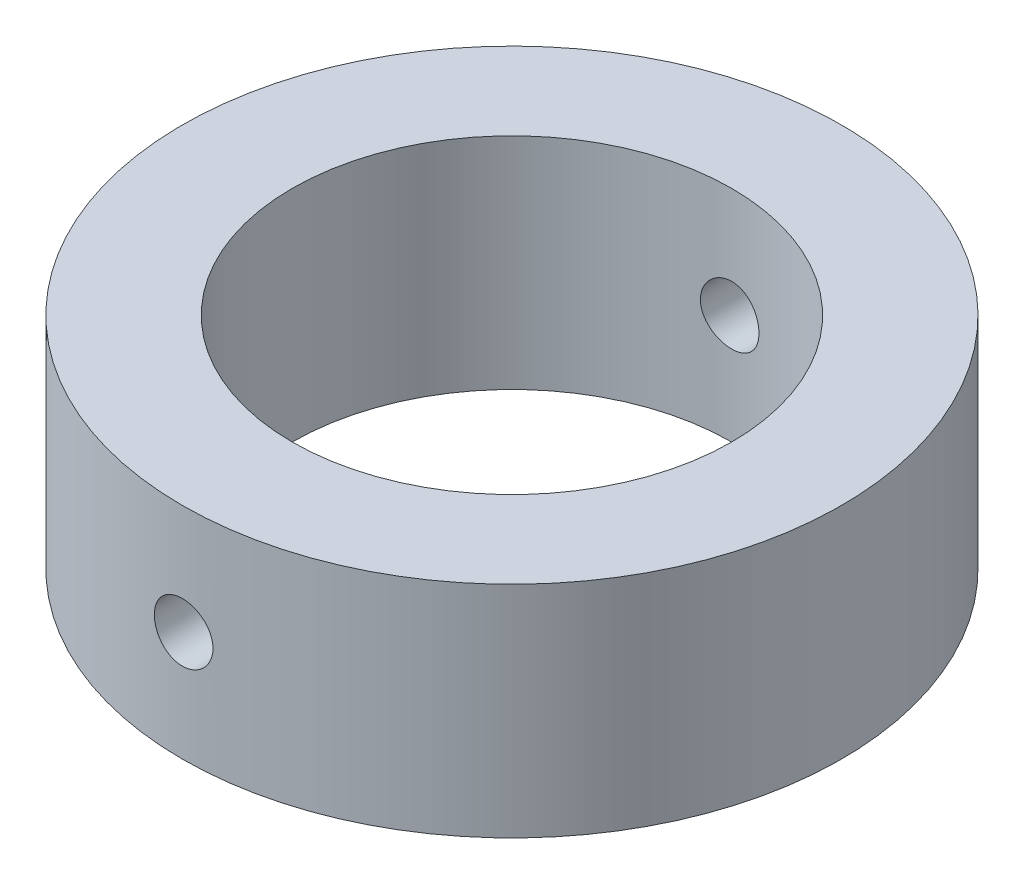
ISO-10303-21;
HEADER;
FILE_DESCRIPTION(('STEP AP214'),'2;1');
FILE_NAME('part.step','',(''),(''),'','','');
FILE_SCHEMA(('AUTOMOTIVE_DESIGN { 1 0 10303 214 1 1 1 1 }'));
ENDSEC;
DATA;
#1=APPLICATION_CONTEXT('core data for automotive mechanical design processes');
#2=APPLICATION_PROTOCOL_DEFINITION('international standard','automotive_design',2000,#1);
#3=PRODUCT_CONTEXT('',#1,'mechanical');
#4=PRODUCT('Part','Part','',(#3));
#5=PRODUCT_RELATED_PRODUCT_CATEGORY('part','',(#4));
#6=PRODUCT_DEFINITION_FORMATION('','',#4);
#7=PRODUCT_DEFINITION_CONTEXT('part definition',#1,'design');
#8=PRODUCT_DEFINITION('design','',#6,#7);
#9=PRODUCT_DEFINITION_SHAPE('','',#8);
#10=(LENGTH_UNIT() NAMED_UNIT(*) SI_UNIT(.MILLI.,.METRE.));
#11=(NAMED_UNIT(*) PLANE_ANGLE_UNIT() SI_UNIT($,.RADIAN.));
#12=(NAMED_UNIT(*) SI_UNIT($,.STERADIAN.) SOLID_ANGLE_UNIT());
#13=UNCERTAINTY_MEASURE_WITH_UNIT(LENGTH_MEASURE(1.E-05),#10,'distance_accuracy_value','');
#14=(GEOMETRIC_REPRESENTATION_CONTEXT(3) GLOBAL_UNCERTAINTY_ASSIGNED_CONTEXT((#13)) GLOBAL_UNIT_ASSIGNED_CONTEXT((#10,
#11,#12)) REPRESENTATION_CONTEXT('',''));
#15=CARTESIAN_POINT('',(0.,0.,0.));
#16=DIRECTION('',(0.,0.,1.));
#17=DIRECTION('',(1.,0.,0.));
#18=AXIS2_PLACEMENT_3D('',#15,#16,#17);
#19=CARTESIAN_POINT('',(0.,15.,0.));
#20=DIRECTION('',(0.,1.,0.));
#21=DIRECTION('',(0.,0.,1.));
#22=AXIS2_PLACEMENT_3D('',#19,#20,#21);
#23=PLANE('',#22);
#24=CARTESIAN_POINT('',(0.,15.,0.));
#25=DIRECTION('',(0.,1.,0.));
#26=DIRECTION('',(0.,0.,1.));
#27=AXIS2_PLACEMENT_3D('',#24,#25,#26);
#28=CIRCLE('',#27,22.5);
#29=CARTESIAN_POINT('',(0.,15.,22.5));
#30=VERTEX_POINT('',#29);
#31=EDGE_CURVE('E10',#30,#30,#28,.T.);
#32=ORIENTED_EDGE('',*,*,#31,.T.);
#33=EDGE_LOOP('',(#32));
#34=FACE_BOUND('',#33,.T.);
#35=CARTESIAN_POINT('',(0.,15.,0.));
#36=DIRECTION('',(0.,1.,0.));
#37=DIRECTION('',(0.,0.,1.));
#38=AXIS2_PLACEMENT_3D('',#35,#36,#37);
#39=CIRCLE('',#38,15.);
#40=CARTESIAN_POINT('',(0.,15.,15.));
#41=VERTEX_POINT('',#40);
#42=EDGE_CURVE('E56',#41,#41,#39,.T.);
#43=ORIENTED_EDGE('',*,*,#42,.F.);
#44=EDGE_LOOP('',(#43));
#45=FACE_BOUND('',#44,.T.);
#46=ADVANCED_FACE('F37',(#34,#45),#23,.T.);
#47=CARTESIAN_POINT('',(0.,0.,0.));
#48=DIRECTION('',(0.,1.,0.));
#49=DIRECTION('',(0.,0.,1.));
#50=AXIS2_PLACEMENT_3D('',#47,#48,#49);
#51=PLANE('',#50);
#52=CARTESIAN_POINT('',(0.,0.,0.));
#53=DIRECTION('',(0.,1.,0.));
#54=DIRECTION('',(0.,0.,1.));
#55=AXIS2_PLACEMENT_3D('',#52,#53,#54);
#56=CIRCLE('',#55,22.5);
#57=CARTESIAN_POINT('',(0.,0.,22.5));
#58=VERTEX_POINT('',#57);
#59=EDGE_CURVE('E51',#58,#58,#56,.T.);
#60=ORIENTED_EDGE('',*,*,#59,.F.);
#61=EDGE_LOOP('',(#60));
#62=FACE_BOUND('',#61,.T.);
#63=CARTESIAN_POINT('',(0.,0.,0.));
#64=DIRECTION('',(0.,1.,0.));
#65=DIRECTION('',(0.,0.,1.));
#66=AXIS2_PLACEMENT_3D('',#63,#64,#65);
#67=CIRCLE('',#66,15.);
#68=CARTESIAN_POINT('',(0.,0.,15.));
#69=VERTEX_POINT('',#68);
#70=EDGE_CURVE('E59',#69,#69,#67,.T.);
#71=ORIENTED_EDGE('',*,*,#70,.T.);
#72=EDGE_LOOP('',(#71));
#73=FACE_BOUND('',#72,.T.);
#74=ADVANCED_FACE('F95',(#62,#73),#51,.F.);
#75=CARTESIAN_POINT('',(0.,15.,0.));
#76=DIRECTION('',(0.,-1.,0.));
#77=DIRECTION('',(0.,0.,-1.));
#78=AXIS2_PLACEMENT_3D('',#75,#76,#77);
#79=CYLINDRICAL_SURFACE('',#78,22.5);
#80=CARTESIAN_POINT('',(0.,9.5,-22.5));
#81=CARTESIAN_POINT('',(-0.112103513817546,9.49999511611229,-22.499998841049));
#82=CARTESIAN_POINT('',(-0.224282655152038,9.49054288809474,-22.4991532643947));
#83=CARTESIAN_POINT('',(-0.445535202780809,9.45297636285716,-22.4958613940795));
#84=CARTESIAN_POINT('',(-0.55460497718198,9.42484110517416,-22.4934133026036));
#85=CARTESIAN_POINT('',(-0.766402486160077,9.3507302809623,-22.4871929547959));
#86=CARTESIAN_POINT('',(-0.869133845484056,9.30476502255392,-22.4834214636859));
#87=CARTESIAN_POINT('',(-1.06539921818257,9.19631792778013,-22.4749768821186));
#88=CARTESIAN_POINT('',(-1.15893514981745,9.13383954629493,-22.47030398031));
#89=CARTESIAN_POINT('',(-1.33444762738097,8.99394599695049,-22.4605656133862));
#90=CARTESIAN_POINT('',(-1.4163940345392,8.91649308082754,-22.4554991759624));
#91=CARTESIAN_POINT('',(-1.56614255656143,8.7489291151478,-22.4455528773909));
#92=CARTESIAN_POINT('',(-1.63394404001183,8.65881750082118,-22.4406730245801));
#93=CARTESIAN_POINT('',(-1.75358177510592,8.46830940774498,-22.4316421475586));
#94=CARTESIAN_POINT('',(-1.80539126224073,8.36789605793649,-22.4274923501196));
#95=CARTESIAN_POINT('',(-1.89140338443427,8.15975224594079,-22.4204029110342));
#96=CARTESIAN_POINT('',(-1.92560636914367,8.05202192911063,-22.4174632453557));
#97=CARTESIAN_POINT('',(-1.97534648409908,7.83260619996081,-22.4131353097158));
#98=CARTESIAN_POINT('',(-1.99093303868159,7.72093207416831,-22.4117429325812));
#99=CARTESIAN_POINT('',(-2.00315056442578,7.49654475542299,-22.4106543281064));
#100=CARTESIAN_POINT('',(-1.99978193588259,7.3838315844629,-22.4109580649477));
#101=CARTESIAN_POINT('',(-1.97422552957042,7.16090501404317,-22.413223630757));
#102=CARTESIAN_POINT('',(-1.95209154398903,7.05068539291124,-22.4151807202191));
#103=CARTESIAN_POINT('',(-1.88971633801144,6.83553177466226,-22.4205250533742));
#104=CARTESIAN_POINT('',(-1.84947491944522,6.73059783540636,-22.4239123127191));
#105=CARTESIAN_POINT('',(-1.75196719256288,6.52882331268717,-22.4317407834582));
#106=CARTESIAN_POINT('',(-1.6946768342642,6.4319944114369,-22.4361834819036));
#107=CARTESIAN_POINT('',(-1.56471480998868,6.24930636067626,-22.4456209172064));
#108=CARTESIAN_POINT('',(-1.49204278900311,6.16344746442695,-22.450615666804));
#109=CARTESIAN_POINT('',(-1.33307902145922,6.00482392826785,-22.4606155201411));
#110=CARTESIAN_POINT('',(-1.24674078579768,5.93210586749202,-22.4656205994758));
#111=CARTESIAN_POINT('',(-1.06305736369639,5.80218861783062,-22.4750606649908));
#112=CARTESIAN_POINT('',(-0.965712168498785,5.744989441293,-22.4794956507175));
#113=CARTESIAN_POINT('',(-0.762747198146106,5.64773621123129,-22.4872968545856));
#114=CARTESIAN_POINT('',(-0.657126383933067,5.60768431475412,-22.4906629382503));
#115=CARTESIAN_POINT('',(-0.440622671897871,5.54589566002051,-22.4959455915378));
#116=CARTESIAN_POINT('',(-0.329739898412666,5.52415846922593,-22.4978621953927));
#117=CARTESIAN_POINT('',(-0.106263448462921,5.4996748810135,-22.5000255466339));
#118=CARTESIAN_POINT('',(0.0063231290074986,5.49686416526941,-22.5002779494562));
#119=CARTESIAN_POINT('',(0.230365844637091,5.51014468400666,-22.4990995832364));
#120=CARTESIAN_POINT('',(0.341821994804213,5.52623571749188,-22.4976688320926));
#121=CARTESIAN_POINT('',(0.560255927280848,5.57680964406438,-22.4932886530511));
#122=CARTESIAN_POINT('',(0.667240687757268,5.61126262969728,-22.4903416949801));
#123=CARTESIAN_POINT('',(0.873911328849087,5.69755186131906,-22.48326001163));
#124=CARTESIAN_POINT('',(0.973597078729131,5.74938841857894,-22.4791252650825));
#125=CARTESIAN_POINT('',(1.16313209411638,5.86913431088114,-22.4701170931205));
#126=CARTESIAN_POINT('',(1.25295441515762,5.93708614561234,-22.4652417269551));
#127=CARTESIAN_POINT('',(1.41994062176186,6.0870724403285,-22.4553062675826));
#128=CARTESIAN_POINT('',(1.49710425692057,6.16910717882488,-22.4502461707237));
#129=CARTESIAN_POINT('',(1.63680416955373,6.34521020409906,-22.4404947242168));
#130=CARTESIAN_POINT('',(1.69929839944319,6.43931191504995,-22.4358044595506));
#131=CARTESIAN_POINT('',(1.80759698106832,6.63671178827788,-22.4273394873951));
#132=CARTESIAN_POINT('',(1.85340151900229,6.74000984794,-22.4235647696917));
#133=CARTESIAN_POINT('',(1.92694925420649,6.9527227510817,-22.4173646141511));
#134=CARTESIAN_POINT('',(1.95471796462343,7.06212871530762,-22.414937271053));
#135=CARTESIAN_POINT('',(1.9914887720945,7.28407285160305,-22.4117004838982));
#136=CARTESIAN_POINT('',(2.00049128492814,7.39661095422164,-22.4108910039965));
#137=CARTESIAN_POINT('',(1.99946904895078,7.62120694922487,-22.4109821979608));
#138=CARTESIAN_POINT('',(1.98951036026824,7.73326515058962,-22.4118769344038));
#139=CARTESIAN_POINT('',(1.95098639898584,7.95411050384462,-22.4152631183473));
#140=CARTESIAN_POINT('',(1.92242110011843,8.06289765111682,-22.417754568102));
#141=CARTESIAN_POINT('',(1.84751200227509,8.27411558871492,-22.4240518674675));
#142=CARTESIAN_POINT('',(1.80116963693465,8.37654689083572,-22.4278576110845));
#143=CARTESIAN_POINT('',(1.69202906668558,8.57218675361684,-22.4363548843694));
#144=CARTESIAN_POINT('',(1.62923106773846,8.665395429689,-22.4410464029507));
#145=CARTESIAN_POINT('',(1.48871346789509,8.84028252549492,-22.4508061076651));
#146=CARTESIAN_POINT('',(1.41094481754436,8.92192146823605,-22.455875497432));
#147=CARTESIAN_POINT('',(1.24278571224903,9.07102261328238,-22.4658087348866));
#148=CARTESIAN_POINT('',(1.15239221773902,9.13848139173525,-22.4706725327074));
#149=CARTESIAN_POINT('',(0.96135210862745,9.257410979504,-22.479656553239));
#150=CARTESIAN_POINT('',(0.860684717484242,9.30884850360968,-22.4837752205534));
#151=CARTESIAN_POINT('',(0.652172657916497,9.39402370717193,-22.4907871749524));
#152=CARTESIAN_POINT('',(0.544336350087794,9.42778161075787,-22.4936818614435));
#153=CARTESIAN_POINT('',(0.3632264698233,9.46809800443949,-22.4971815146108));
#154=CARTESIAN_POINT('',(0.291115543292068,9.48004521340147,-22.4982335985338));
#155=CARTESIAN_POINT('',(0.146013772450285,9.49599778954995,-22.4996432176176));
#156=CARTESIAN_POINT('',(0.0730229308628365,9.5000031813079,-22.5000007549273));
#157=CARTESIAN_POINT('',(0.,9.5,-22.5));
#158=B_SPLINE_CURVE_WITH_KNOTS('',3,(#80,#81,#82,#83,#84,#85,#86,#87,#88,#89,#90,#91,#92,#93,
#94,#95,#96,#97,#98,#99,#100,#101,#102,#103,#104,#105,#106,#107,#108,#109,#110,#111,#112,#113,
#114,#115,#116,#117,#118,#119,#120,#121,#122,#123,#124,#125,#126,#127,#128,#129,#130,#131,#132,
#133,#134,#135,#136,#137,#138,#139,#140,#141,#142,#143,#144,#145,#146,#147,#148,#149,#150,#151,
#152,#153,#154,#155,#156,#157),.UNSPECIFIED.,.T.,.F.,(4,2,2,2,2,2,2,2,2,2,2,2,2,2,2,2,2,2,2,2,2,
2,2,2,2,2,2,2,2,2,2,2,2,2,2,2,2,2,4),(0.,0.336043915895959,0.6724654773507,1.00869283142059,
1.34484989551892,1.68186567154393,2.01889648835957,2.35648834568506,2.69407349845462,
3.03076039765134,3.36744018672832,3.70315811056491,4.03887970862984,4.37507715351966,
4.71128235869213,5.04865685412811,5.38603161800295,5.72344880957018,6.06085803213696,
6.39712004703985,6.73337848625502,7.06909090308952,7.40480933152664,7.74142316985628,
8.07804366601698,8.41561756166209,8.75318769105355,9.09027925394883,9.42736334824279,
9.76327520249732,10.0991875309702,10.4350727754115,10.7709538160566,11.1079546578805,
11.4450367765554,11.7828146049765,12.1202051928234,12.3391009858617,12.5579961016498),.UNSPECIFIED.);
#159=CARTESIAN_POINT('',(0.,9.5,-22.5));
#160=VERTEX_POINT('',#159);
#161=EDGE_CURVE('E84',#160,#160,#158,.T.);
#162=ORIENTED_EDGE('',*,*,#161,.T.);
#163=EDGE_LOOP('',(#162));
#164=FACE_BOUND('',#163,.T.);
#165=CARTESIAN_POINT('',(2.,7.5,22.410934831015));
#166=CARTESIAN_POINT('',(1.99999511522552,7.38789747268648,22.4109360071251));
#167=CARTESIAN_POINT('',(1.9905430479422,7.27571931468287,22.4117850173794));
#168=CARTESIAN_POINT('',(1.95297721920376,7.05446881018577,22.4150891541921));
#169=CARTESIAN_POINT('',(1.92484249389287,6.94540009635717,22.4175460849571));
#170=CARTESIAN_POINT('',(1.85073322709375,6.73360482978959,22.423785607849));
#171=CARTESIAN_POINT('',(1.80476901906143,6.63087464332245,22.4275674319831));
#172=CARTESIAN_POINT('',(1.69632439770985,6.43461123510095,22.436029669616));
#173=CARTESIAN_POINT('',(1.63384743668479,6.34107609655433,22.4407098952318));
#174=CARTESIAN_POINT('',(1.49395532099579,6.16556272051879,22.4504568290465));
#175=CARTESIAN_POINT('',(1.4165021008378,6.08361487370073,22.4555245017502));
#176=CARTESIAN_POINT('',(1.24893692300769,5.93386357395253,22.4654665249388));
#177=CARTESIAN_POINT('',(1.15882440448958,5.86606074802137,22.4703408668464));
#178=CARTESIAN_POINT('',(0.968315522090549,5.74642161138169,22.4793563035631));
#179=CARTESIAN_POINT('',(0.867902442616773,5.69461181798606,22.483496175801));
#180=CARTESIAN_POINT('',(0.659759218270459,5.60859905496343,22.4905657916581));
#181=CARTESIAN_POINT('',(0.552029217237069,5.57439573933414,22.493495559058));
#182=CARTESIAN_POINT('',(0.33261444306639,5.52465492949966,22.4978081085742));
#183=CARTESIAN_POINT('',(0.220940962422713,5.50906798317233,22.4991949885079));
#184=CARTESIAN_POINT('',(-0.003445094013057,5.49684945042464,22.5002794033935));
#185=CARTESIAN_POINT('',(-0.116157648043598,5.50021746792245,22.499976973645));
#186=CARTESIAN_POINT('',(-0.339086920289837,5.52577290942403,22.4977202169622));
#187=CARTESIAN_POINT('',(-0.449309788290655,5.5479071562608,22.4957705577751));
#188=CARTESIAN_POINT('',(-0.66446976548325,5.61028401122245,22.4904439429723));
#189=CARTESIAN_POINT('',(-0.769406818534318,5.65052681163343,22.4870669722008));
#190=CARTESIAN_POINT('',(-0.971185105658271,5.74803739432538,22.4792575363271));
#191=CARTESIAN_POINT('',(-1.06801481450164,5.80532890328557,22.4748236019714));
#192=CARTESIAN_POINT('',(-1.25070399192931,5.93529338053422,22.4653982833615));
#193=CARTESIAN_POINT('',(-1.33656320680199,6.00796670445051,22.46040688622));
#194=CARTESIAN_POINT('',(-1.49518526143645,6.16693139289951,22.4504069651226));
#195=CARTESIAN_POINT('',(-1.56790178542425,6.25326898135422,22.4453984416304));
#196=CARTESIAN_POINT('',(-1.6978162432692,6.43695056218095,22.4359460766536));
#197=CARTESIAN_POINT('',(-1.75501416162412,6.53429456554761,22.4315022357331));
#198=CARTESIAN_POINT('',(-1.85226648783546,6.73725922001797,22.4236817045843));
#199=CARTESIAN_POINT('',(-1.8923183488708,6.8428810979363,22.4203051729104));
#200=CARTESIAN_POINT('',(-1.95410660645255,7.0593871210265,22.4150047410718));
#201=CARTESIAN_POINT('',(-1.97584344194887,7.17027114001517,22.4130808060934));
#202=CARTESIAN_POINT('',(-2.00032569107356,7.39374815824912,22.4109091881806));
#203=CARTESIAN_POINT('',(-2.00313575767367,7.50633402152697,22.4106557988021));
#204=CARTESIAN_POINT('',(-1.98985419559461,7.73037515257314,22.4118389025826));
#205=CARTESIAN_POINT('',(-1.97376276790927,7.8418304323511,22.4132753777719));
#206=CARTESIAN_POINT('',(-1.92318895349573,8.06026009163581,22.4176711581514));
#207=CARTESIAN_POINT('',(-1.88873686351237,8.16724154063912,22.4206279543932));
#208=CARTESIAN_POINT('',(-1.80245053293553,8.37390595532794,22.4277291573228));
#209=CARTESIAN_POINT('',(-1.75061597580114,8.47358878806278,22.4318735856378));
#210=CARTESIAN_POINT('',(-1.63087301798368,8.66312183256519,22.4408969120437));
#211=CARTESIAN_POINT('',(-1.56292160925273,8.75294477840378,22.4457777623834));
#212=CARTESIAN_POINT('',(-1.41293580547728,8.91993244421877,22.4557174538765));
#213=CARTESIAN_POINT('',(-1.33090113493448,8.99709691651097,22.4607762985102));
#214=CARTESIAN_POINT('',(-1.15479774072963,9.1367986142808,22.4705190431249));
#215=CARTESIAN_POINT('',(-1.06069558151874,9.19929377953081,22.4752018402345));
#216=CARTESIAN_POINT('',(-0.863294564622061,9.30759400275743,22.4836489226808));
#217=CARTESIAN_POINT('',(-0.759995809673469,9.3533992471517,22.4874132182767));
#218=CARTESIAN_POINT('',(-0.547283364751766,9.42694745478989,22.4935941204934));
#219=CARTESIAN_POINT('',(-0.437878660324094,9.45471623720608,22.4960126528582));
#220=CARTESIAN_POINT('',(-0.215937179042849,9.49148761564037,22.4992373725504));
#221=CARTESIAN_POINT('',(-0.103400470516101,9.50049062072212,22.5000435950237));
#222=CARTESIAN_POINT('',(0.121196388318481,9.49946981069617,22.4999528877337));
#223=CARTESIAN_POINT('',(0.233256844346991,9.48951146365985,22.4990618182255));
#224=CARTESIAN_POINT('',(0.454106791656323,9.4509873920564,22.4956882225565));
#225=CARTESIAN_POINT('',(0.562896279022201,9.42242164521946,22.4932056944911));
#226=CARTESIAN_POINT('',(0.774118871461724,9.34751077955741,22.4869275921709));
#227=CARTESIAN_POINT('',(0.876552482535993,9.30116707817657,22.4831321225999));
#228=CARTESIAN_POINT('',(1.07219640498532,9.19202312182397,22.4746522731988));
#229=CARTESIAN_POINT('',(1.16540683320082,9.12922307536003,22.4699679046315));
#230=CARTESIAN_POINT('',(1.34029380052028,8.98870323453424,22.4602164318585));
#231=CARTESIAN_POINT('',(1.42193123705195,8.91093485824123,22.4551481148943));
#232=CARTESIAN_POINT('',(1.57102947130107,8.7427769192718,22.4452103046903));
#233=CARTESIAN_POINT('',(1.6384868412357,8.65238431367812,22.440340859753));
#234=CARTESIAN_POINT('',(1.7574149258001,8.46134491778109,22.4313412042515));
#235=CARTESIAN_POINT('',(1.80885209887825,8.36067719138989,22.4272125522435));
#236=CARTESIAN_POINT('',(1.8940265530838,8.15216441848042,22.4201807917805));
#237=CARTESIAN_POINT('',(1.92778406328535,8.04432773466798,22.4172762834067));
#238=CARTESIAN_POINT('',(1.96809934007057,7.86321890838527,22.4137641276837));
#239=CARTESIAN_POINT('',(1.9800460464574,7.79110949082045,22.4127080623822));
#240=CARTESIAN_POINT('',(1.99599795488959,7.646010743615,22.4112930320935));
#241=CARTESIAN_POINT('',(2.00000318184756,7.57302141673539,22.4109340649196));
#242=CARTESIAN_POINT('',(2.,7.5,22.410934831015));
#243=B_SPLINE_CURVE_WITH_KNOTS('',3,(#165,#166,#167,#168,#169,#170,#171,#172,#173,#174,#175,
#176,#177,#178,#179,#180,#181,#182,#183,#184,#185,#186,#187,#188,#189,#190,#191,#192,#193,#194,
#195,#196,#197,#198,#199,#200,#201,#202,#203,#204,#205,#206,#207,#208,#209,#210,#211,#212,#213,
#214,#215,#216,#217,#218,#219,#220,#221,#222,#223,#224,#225,#226,#227,#228,#229,#230,#231,#232,
#233,#234,#235,#236,#237,#238,#239,#240,#241,#242),.UNSPECIFIED.,.T.,.F.,(4,2,2,2,2,2,2,2,2,2,2,
2,2,2,2,2,2,2,2,2,2,2,2,2,2,2,2,2,2,2,2,2,2,2,2,2,2,2,4),(0.,0.336040952805804,
0.672459616598916,1.00868359242389,1.34483732998096,1.68185698324535,2.018891572232,
2.35648201785151,2.69406582889463,3.03075088081492,3.36742889740975,3.70315605837982,
4.03888678436091,4.37508694934627,4.71129488813434,5.04866547878392,5.38603640644658,
5.72345742874638,6.060870363963,6.39713012495912,6.73338631028417,7.06908935284584,
7.40479850901117,7.74141379388865,8.07803566442131,8.41561122770332,8.75318302032748,
9.09027050808799,9.42735064780848,9.76326905724093,10.0991878687101,10.4350799027869,
10.7709676811962,11.10796459915,11.4450428867655,11.7828222446087,12.1202142661767,
12.3391055259931,12.557996099141),.UNSPECIFIED.);
#244=CARTESIAN_POINT('',(2.,7.5,22.410934831015));
#245=VERTEX_POINT('',#244);
#246=EDGE_CURVE('E79',#245,#245,#243,.T.);
#247=ORIENTED_EDGE('',*,*,#246,.T.);
#248=EDGE_LOOP('',(#247));
#249=FACE_BOUND('',#248,.T.);
#250=ORIENTED_EDGE('',*,*,#31,.F.);
#251=EDGE_LOOP('',(#250));
#252=FACE_BOUND('',#251,.T.);
#253=ORIENTED_EDGE('',*,*,#59,.T.);
#254=EDGE_LOOP('',(#253));
#255=FACE_BOUND('',#254,.T.);
#256=ADVANCED_FACE('F39',(#164,#249,#252,#255),#79,.T.);
#257=CARTESIAN_POINT('',(0.,15.,0.));
#258=DIRECTION('',(0.,-1.,0.));
#259=DIRECTION('',(0.,0.,-1.));
#260=AXIS2_PLACEMENT_3D('',#257,#258,#259);
#261=CYLINDRICAL_SURFACE('',#260,15.);
#262=CARTESIAN_POINT('',(0.,9.5,-15.));
#263=CARTESIAN_POINT('',(-0.111808835669284,9.49999529029309,-14.9999983574254));
#264=CARTESIAN_POINT('',(-0.22368597927628,9.49059246203753,-14.9987367072719));
#265=CARTESIAN_POINT('',(-0.444322725138079,9.45323365095044,-14.993825111269));
#266=CARTESIAN_POINT('',(-0.553079022333037,9.42525870510285,-14.9901727244172));
#267=CARTESIAN_POINT('',(-0.764248312626984,9.35159828245855,-14.9808907984907));
#268=CARTESIAN_POINT('',(-0.866665683058493,9.30592518896156,-14.9752626421097));
#269=CARTESIAN_POINT('',(-1.0623638950303,9.19819308619373,-14.9626538666039));
#270=CARTESIAN_POINT('',(-1.15564620633702,9.13613671883354,-14.9556734655857));
#271=CARTESIAN_POINT('',(-1.33102582250468,8.99698673839582,-14.9410899478996));
#272=CARTESIAN_POINT('',(-1.41305798549586,8.91981135499153,-14.9334835816211));
#273=CARTESIAN_POINT('',(-1.56304735673102,8.75278981092335,-14.9185313755795));
#274=CARTESIAN_POINT('',(-1.63100381997221,8.66294298000419,-14.9111855496234));
#275=CARTESIAN_POINT('',(-1.75115902268907,8.47270087705497,-14.8975543544019));
#276=CARTESIAN_POINT('',(-1.80329607482578,8.37226631752138,-14.8912731776576));
#277=CARTESIAN_POINT('',(-1.8899384500729,8.16396893276321,-14.8805258737923));
#278=CARTESIAN_POINT('',(-1.92444453245278,8.05610642764669,-14.8760596685121));
#279=CARTESIAN_POINT('',(-1.97464606772174,7.83669418949834,-14.8694793656867));
#280=CARTESIAN_POINT('',(-1.99045204228506,7.72517016546708,-14.8673514537014));
#281=CARTESIAN_POINT('',(-2.00314680548117,7.50103382039405,-14.8656465160931));
#282=CARTESIAN_POINT('',(-2.00003645633601,7.38842154918911,-14.866069374204));
#283=CARTESIAN_POINT('',(-1.97507745939234,7.16607886997207,-14.8694055577299));
#284=CARTESIAN_POINT('',(-1.95335097531762,7.0563344701143,-14.8723026462234));
#285=CARTESIAN_POINT('',(-1.89196724634371,6.84206316323991,-14.8802355277475));
#286=CARTESIAN_POINT('',(-1.85230959261457,6.73753637524499,-14.8852713695413));
#287=CARTESIAN_POINT('',(-1.75605929143191,6.5362903652928,-14.8969326111103));
#288=CARTESIAN_POINT('',(-1.69941397913749,6.4395966288057,-14.903562941239));
#289=CARTESIAN_POINT('',(-1.57083393344289,6.25704091808234,-14.9176623621993));
#290=CARTESIAN_POINT('',(-1.49889840502385,6.17117950744583,-14.9251314966353));
#291=CARTESIAN_POINT('',(-1.34110490026362,6.01201698741811,-14.9401389923359));
#292=CARTESIAN_POINT('',(-1.25514170702645,5.93882015729768,-14.947677435412));
#293=CARTESIAN_POINT('',(-1.07209417013341,5.80787795507161,-14.9619192381826));
#294=CARTESIAN_POINT('',(-0.97500979444237,5.75013262747648,-14.9686225954715));
#295=CARTESIAN_POINT('',(-0.77239221973047,5.65173088230526,-14.9804439374358));
#296=CARTESIAN_POINT('',(-0.666855578841231,5.61108146895369,-14.9855612720896));
#297=CARTESIAN_POINT('',(-0.45037092433625,5.54811068102766,-14.9936282590407));
#298=CARTESIAN_POINT('',(-0.339423199542257,5.52578832936061,-14.9965780268993));
#299=CARTESIAN_POINT('',(-0.116166903325644,5.50024156722888,-14.9999624137686));
#300=CARTESIAN_POINT('',(-0.00387503454704274,5.49687359821652,-15.0004159384905));
#301=CARTESIAN_POINT('',(0.219671617218717,5.50895166412718,-14.9988079153852));
#302=CARTESIAN_POINT('',(0.330926425345664,5.52439724178236,-14.996746428686));
#303=CARTESIAN_POINT('',(0.548813715572938,5.57354465338398,-14.990351753581));
#304=CARTESIAN_POINT('',(0.655462016512044,5.60717756832215,-14.9860271430292));
#305=CARTESIAN_POINT('',(0.861605098793559,5.69167296593709,-14.9755900925429));
#306=CARTESIAN_POINT('',(0.961099607015637,5.74253610601325,-14.9694775843944));
#307=CARTESIAN_POINT('',(1.15074887861608,5.86039215558331,-14.9560983737007));
#308=CARTESIAN_POINT('',(1.2408458143966,5.92747736571333,-14.9488251504572));
#309=CARTESIAN_POINT('',(1.4085529469919,6.07574332922426,-14.9339572870998));
#310=CARTESIAN_POINT('',(1.48616257662378,6.15692472251643,-14.9263626324062));
#311=CARTESIAN_POINT('',(1.62720549423098,6.33171314263955,-14.9116490247351));
#312=CARTESIAN_POINT('',(1.69054327608938,6.42539756673816,-14.904533487753));
#313=CARTESIAN_POINT('',(1.80058351078814,6.62215941028093,-14.8916413300182));
#314=CARTESIAN_POINT('',(1.84728633510346,6.72523661991038,-14.8858646793678));
#315=CARTESIAN_POINT('',(1.92257836500746,6.93755724202769,-14.8763281178008));
#316=CARTESIAN_POINT('',(1.95122028846795,7.04678168521081,-14.872562342326));
#317=CARTESIAN_POINT('',(1.98974667143959,7.26854363212876,-14.8674574869829));
#318=CARTESIAN_POINT('',(1.99963213426782,7.38108095832444,-14.8661182773134));
#319=CARTESIAN_POINT('',(2.00034485806189,7.60532349085351,-14.8660223129545));
#320=CARTESIAN_POINT('',(1.99132219194493,7.71702824096424,-14.8672452228252));
#321=CARTESIAN_POINT('',(1.95479376686689,7.93731787510387,-14.872091838742));
#322=CARTESIAN_POINT('',(1.92728801483269,8.04590276030198,-14.8757155438883));
#323=CARTESIAN_POINT('',(1.85462310332207,8.25684368325159,-14.8849489027276));
#324=CARTESIAN_POINT('',(1.80947220819041,8.35920261111686,-14.890557626594));
#325=CARTESIAN_POINT('',(1.70281342759737,8.55491588382606,-14.9031304571282));
#326=CARTESIAN_POINT('',(1.64130522630429,8.64827005475604,-14.910094589966));
#327=CARTESIAN_POINT('',(1.50312448509508,8.82408964992841,-14.9246596718306));
#328=CARTESIAN_POINT('',(1.42634027226901,8.90646694775513,-14.9322650575408));
#329=CARTESIAN_POINT('',(1.26002169349824,9.05722321636155,-14.9472171900166));
#330=CARTESIAN_POINT('',(1.17048434072978,9.12559889875025,-14.9545638756898));
#331=CARTESIAN_POINT('',(0.980752987852822,9.24666713846652,-14.9682063513753));
#332=CARTESIAN_POINT('',(0.880514620743965,9.29929066655525,-14.9744974642689));
#333=CARTESIAN_POINT('',(0.672592409587329,9.38688059854508,-14.9852732065897));
#334=CARTESIAN_POINT('',(0.564916678969889,9.42186590862486,-14.9897597692431));
#335=CARTESIAN_POINT('',(0.380588408098418,9.46494800638518,-14.9953572174327));
#336=CARTESIAN_POINT('',(0.305091081955778,9.47807324352364,-14.9970896363507));
#337=CARTESIAN_POINT('',(0.153073171616111,9.49560081416547,-14.9994115849077));
#338=CARTESIAN_POINT('',(0.0765525964512402,9.5000032246136,-15.000001124628));
#339=CARTESIAN_POINT('',(0.,9.5,-15.));
#340=B_SPLINE_CURVE_WITH_KNOTS('',3,(#262,#263,#264,#265,#266,#267,#268,#269,#270,#271,#272,
#273,#274,#275,#276,#277,#278,#279,#280,#281,#282,#283,#284,#285,#286,#287,#288,#289,#290,#291,
#292,#293,#294,#295,#296,#297,#298,#299,#300,#301,#302,#303,#304,#305,#306,#307,#308,#309,#310,
#311,#312,#313,#314,#315,#316,#317,#318,#319,#320,#321,#322,#323,#324,#325,#326,#327,#328,#329,
#330,#331,#332,#333,#334,#335,#336,#337,#338,#339),.UNSPECIFIED.,.T.,.F.,(4,2,2,2,2,2,2,2,2,2,2,
2,2,2,2,2,2,2,2,2,2,2,2,2,2,2,2,2,2,2,2,2,2,2,2,2,2,2,4),(0.,0.335146851305743,
0.670636430885044,1.0058916928274,1.34109292564035,1.67815978443559,2.01524447904836,
2.35362721511648,2.69199537766205,3.02835355914359,3.3646964092492,3.69884885098044,
4.0330089117585,4.36821583137898,4.70344018443797,5.04130544484849,5.37917167852296,
5.71717620202539,6.05516270391743,6.39058584992061,6.72600084354478,7.06015363396463,
7.39431917503546,7.73043274769884,8.06656158258761,8.4048770453545,8.74318495273048,
9.08050074735454,9.41779849783634,9.75242927496624,10.0870599266875,10.4215340370262,
10.756014605959,11.0930366783511,11.4301378125116,11.7686952667452,12.1068890499242,
12.3363573904731,12.5658237068544),.UNSPECIFIED.);
#341=CARTESIAN_POINT('',(0.,9.5,-15.));
#342=VERTEX_POINT('',#341);
#343=EDGE_CURVE('E42',#342,#342,#340,.T.);
#344=ORIENTED_EDGE('',*,*,#343,.F.);
#345=EDGE_LOOP('',(#344));
#346=FACE_BOUND('',#345,.T.);
#347=CARTESIAN_POINT('',(2.,7.5,14.8660687473185));
#348=CARTESIAN_POINT('',(1.99999528594759,7.38819614453247,14.8660704451043));
#349=CARTESIAN_POINT('',(1.99059326704128,7.27632396688378,14.8673436464034));
#350=CARTESIAN_POINT('',(1.9532379626613,7.05569753766411,14.8722964859732));
#351=CARTESIAN_POINT('',(1.92526569649113,6.9469465950828,14.8759785863295));
#352=CARTESIAN_POINT('',(1.85161311140264,6.73578863177369,14.8853249214529));
#353=CARTESIAN_POINT('',(1.80594530275044,6.63337718838231,14.8909877556206));
#354=CARTESIAN_POINT('',(1.69822564880686,6.43768892429044,14.9036558225185));
#355=CARTESIAN_POINT('',(1.63617643263469,6.34441064106197,14.9106608397868));
#356=CARTESIAN_POINT('',(1.49703370489518,6.16902654533153,14.9252737732073));
#357=CARTESIAN_POINT('',(1.41985682274859,6.08698713432062,14.9328848849373));
#358=CARTESIAN_POINT('',(1.2528292287261,5.93698375454362,14.9478237625824));
#359=CARTESIAN_POINT('',(1.16297786647198,5.86902050852381,14.9551515139324));
#360=CARTESIAN_POINT('',(0.972731724927612,5.7488581582836,14.9687309976037));
#361=CARTESIAN_POINT('',(0.872298437711222,5.69671951070976,14.9749785650228));
#362=CARTESIAN_POINT('',(0.664003816037367,5.6100738358192,14.9856585341581));
#363=CARTESIAN_POINT('',(0.556142793922401,5.57556606762232,14.990091012146));
#364=CARTESIAN_POINT('',(0.33673537501409,5.52536109041973,14.9966188619561));
#365=CARTESIAN_POINT('',(0.225214723469898,5.50955318498804,14.9987279820508));
#366=CARTESIAN_POINT('',(0.00108500230365692,5.49685339126318,15.0004184797152));
#367=CARTESIAN_POINT('',(-0.111524018722466,5.49996066226348,14.9999999696283));
#368=CARTESIAN_POINT('',(-0.333880124465769,5.52491473054095,14.9966934411691));
#369=CARTESIAN_POINT('',(-0.443640837361784,5.54664246474565,14.9938211133781));
#370=CARTESIAN_POINT('',(-0.657944122712554,5.60803432702151,14.9859472409229));
#371=CARTESIAN_POINT('',(-0.762486584541839,5.64769883516812,14.9809456511403));
#372=CARTESIAN_POINT('',(-0.963751808424129,5.74396344112182,14.9693481900416));
#373=CARTESIAN_POINT('',(-1.06044984935326,5.80061462318308,14.9627475214588));
#374=CARTESIAN_POINT('',(-1.24301169073479,5.92920725728286,14.9486895041904));
#375=CARTESIAN_POINT('',(-1.32887492586682,6.0011495066278,14.9412321108429));
#376=CARTESIAN_POINT('',(-1.48803006154539,6.15894784835893,14.9262258809566));
#377=CARTESIAN_POINT('',(-1.56121903353021,6.24490776819363,14.918676784244));
#378=CARTESIAN_POINT('',(-1.69214693057191,6.42794593137257,14.9043949876924));
#379=CARTESIAN_POINT('',(-1.74988579436353,6.52502421880297,14.8976622910907));
#380=CARTESIAN_POINT('',(-1.848282860865,6.7276400003467,14.8857757633434));
#381=CARTESIAN_POINT('',(-1.88893208906707,6.83318190451849,14.8806227621479));
#382=CARTESIAN_POINT('',(-1.95190090044924,7.04967802063838,14.8724947546572));
#383=CARTESIAN_POINT('',(-1.97422149354143,7.16063193402657,14.8695196283616));
#384=CARTESIAN_POINT('',(-1.99976160768727,7.38389133500496,14.8661064501035));
#385=CARTESIAN_POINT('',(-2.00312631098812,7.49617993033254,14.8656491151163));
#386=CARTESIAN_POINT('',(-1.99104288188796,7.71971925610474,14.867272242967));
#387=CARTESIAN_POINT('',(-1.97559520729776,7.83097001173945,14.8693526440475));
#388=CARTESIAN_POINT('',(-1.9264480503702,8.04883598640561,14.8757992043677));
#389=CARTESIAN_POINT('',(-1.8928195032336,8.1554674930181,14.8801564778765));
#390=CARTESIAN_POINT('',(-1.80833845080125,8.36157891345244,14.8906585901441));
#391=CARTESIAN_POINT('',(-1.75748526209383,8.46105854332372,14.8968034998284));
#392=CARTESIAN_POINT('',(-1.63964406417211,8.65069731044081,14.9102344661952));
#393=CARTESIAN_POINT('',(-1.57256123166301,8.74079704836823,14.9175271378913));
#394=CARTESIAN_POINT('',(-1.42429832312799,8.90851093843709,14.9324114351651));
#395=CARTESIAN_POINT('',(-1.34311762143754,8.98612453614802,14.9400030739993));
#396=CARTESIAN_POINT('',(-1.16832754835824,9.12717655392112,14.9546894865533));
#397=CARTESIAN_POINT('',(-1.07464064093253,9.19051931637161,14.9617807004972));
#398=CARTESIAN_POINT('',(-0.877872452317622,9.30056828217533,14.974613414783));
#399=CARTESIAN_POINT('',(-0.774791382513701,9.34727485975611,14.9803549454849));
#400=CARTESIAN_POINT('',(-0.562472772523435,9.42256926158813,14.9898256469115));
#401=CARTESIAN_POINT('',(-0.453254784247364,9.45121142908355,14.9935608482078));
#402=CARTESIAN_POINT('',(-0.2315064934232,9.48974048546098,14.9986231668662));
#403=CARTESIAN_POINT('',(-0.118976362199825,9.49962834270771,14.9999504085613));
#404=CARTESIAN_POINT('',(0.105269873711587,9.50034826724032,15.0000464724842));
#405=CARTESIAN_POINT('',(0.216985525921879,9.49132747059439,14.9988350491343));
#406=CARTESIAN_POINT('',(0.437297443052352,9.45479895876802,14.9940293321986));
#407=CARTESIAN_POINT('',(0.545893712341046,9.4272912694787,14.9904350419501));
#408=CARTESIAN_POINT('',(0.756858234588858,9.35461795292334,14.9812655664247));
#409=CARTESIAN_POINT('',(0.859229301543909,9.30946037359194,14.9756912840831));
#410=CARTESIAN_POINT('',(1.05496407863087,9.20278445035427,14.9631774939599));
#411=CARTESIAN_POINT('',(1.14832762239916,9.14126580434756,14.95623796097));
#412=CARTESIAN_POINT('',(1.32414728606674,9.00307331799636,14.9417029120984));
#413=CARTESIAN_POINT('',(1.406517157164,8.92629020986081,14.9341029029987));
#414=CARTESIAN_POINT('',(1.55725895587216,8.75997693095264,14.919138648968));
#415=CARTESIAN_POINT('',(1.62562757530232,8.67044375607874,14.9117744601021));
#416=CARTESIAN_POINT('',(1.74668790978495,8.48071605842911,14.8980810988492));
#417=CARTESIAN_POINT('',(1.79930940429126,8.3804764084899,14.8917566176026));
#418=CARTESIAN_POINT('',(1.8868951828149,8.17255153248295,14.8809136658427));
#419=CARTESIAN_POINT('',(1.92187839666366,8.06487443024063,14.8763932602426));
#420=CARTESIAN_POINT('',(1.96495480378583,7.88055172127446,14.8707513382361));
#421=CARTESIAN_POINT('',(1.97807748135802,7.80506172703186,14.8690042861798));
#422=CARTESIAN_POINT('',(1.99560165343181,7.6530584905295,14.866662414787));
#423=CARTESIAN_POINT('',(2.00000322742319,7.57654525760259,14.8660675849485));
#424=CARTESIAN_POINT('',(2.,7.5,14.8660687473185));
#425=B_SPLINE_CURVE_WITH_KNOTS('',3,(#347,#348,#349,#350,#351,#352,#353,#354,#355,#356,#357,
#358,#359,#360,#361,#362,#363,#364,#365,#366,#367,#368,#369,#370,#371,#372,#373,#374,#375,#376,
#377,#378,#379,#380,#381,#382,#383,#384,#385,#386,#387,#388,#389,#390,#391,#392,#393,#394,#395,
#396,#397,#398,#399,#400,#401,#402,#403,#404,#405,#406,#407,#408,#409,#410,#411,#412,#413,#414,
#415,#416,#417,#418,#419,#420,#421,#422,#423,#424),.UNSPECIFIED.,.T.,.F.,(4,2,2,2,2,2,2,2,2,2,2,
2,2,2,2,2,2,2,2,2,2,2,2,2,2,2,2,2,2,2,2,2,2,2,2,2,2,2,4),(0.,0.335131889250449,
0.670606846105683,1.00584506276825,1.34102950834956,1.67811595121165,2.01521969762238,
2.35359556525146,2.69195721256928,3.02830569524969,3.36463922864856,3.69883808669953,
4.03304402666679,4.36826528456251,4.70350402584628,5.04134915068959,5.37919561519091,
5.71721927655741,6.05522431149101,6.3906370258193,6.72604157783542,7.06014684818595,
7.39426537618209,7.73038528142332,8.06652010750621,8.40484511764503,8.74316251675152,
9.08045723770334,9.41773454222146,9.752397098563,10.0870591862064,10.4215688535019,
10.7560846978108,11.0930874236894,11.430169684094,11.768733419821,12.1069330231324,
12.3363794094425,12.5658237044201),.UNSPECIFIED.);
#426=CARTESIAN_POINT('',(2.,7.5,14.8660687473185));
#427=VERTEX_POINT('',#426);
#428=EDGE_CURVE('E61',#427,#427,#425,.T.);
#429=ORIENTED_EDGE('',*,*,#428,.F.);
#430=EDGE_LOOP('',(#429));
#431=FACE_BOUND('',#430,.T.);
#432=ORIENTED_EDGE('',*,*,#42,.T.);
#433=EDGE_LOOP('',(#432));
#434=FACE_BOUND('',#433,.T.);
#435=ORIENTED_EDGE('',*,*,#70,.F.);
#436=EDGE_LOOP('',(#435));
#437=FACE_BOUND('',#436,.T.);
#438=ADVANCED_FACE('F66',(#346,#431,#434,#437),#261,.F.);
#439=CARTESIAN_POINT('',(0.,7.5,-22.5));
#440=DIRECTION('',(0.,0.,1.));
#441=DIRECTION('',(1.,0.,0.));
#442=AXIS2_PLACEMENT_3D('',#439,#440,#441);
#443=CYLINDRICAL_SURFACE('',#442,2.);
#444=ORIENTED_EDGE('',*,*,#428,.T.);
#445=EDGE_LOOP('',(#444));
#446=FACE_BOUND('',#445,.T.);
#447=ORIENTED_EDGE('',*,*,#246,.F.);
#448=EDGE_LOOP('',(#447));
#449=FACE_BOUND('',#448,.T.);
#450=ADVANCED_FACE('F72',(#446,#449),#443,.F.);
#451=ORIENTED_EDGE('',*,*,#343,.T.);
#452=EDGE_LOOP('',(#451));
#453=FACE_BOUND('',#452,.T.);
#454=ORIENTED_EDGE('',*,*,#161,.F.);
#455=EDGE_LOOP('',(#454));
#456=FACE_BOUND('',#455,.T.);
#457=ADVANCED_FACE('F69',(#453,#456),#443,.F.);
#458=CLOSED_SHELL('',(#46,#74,#256,#438,#450,#457));
#459=MANIFOLD_SOLID_BREP('B2',#458);
#460=ADVANCED_BREP_SHAPE_REPRESENTATION('',(#18,#459),#14);
#461=SHAPE_DEFINITION_REPRESENTATION(#9,#460);
ENDSEC;
END-ISO-10303-21;
